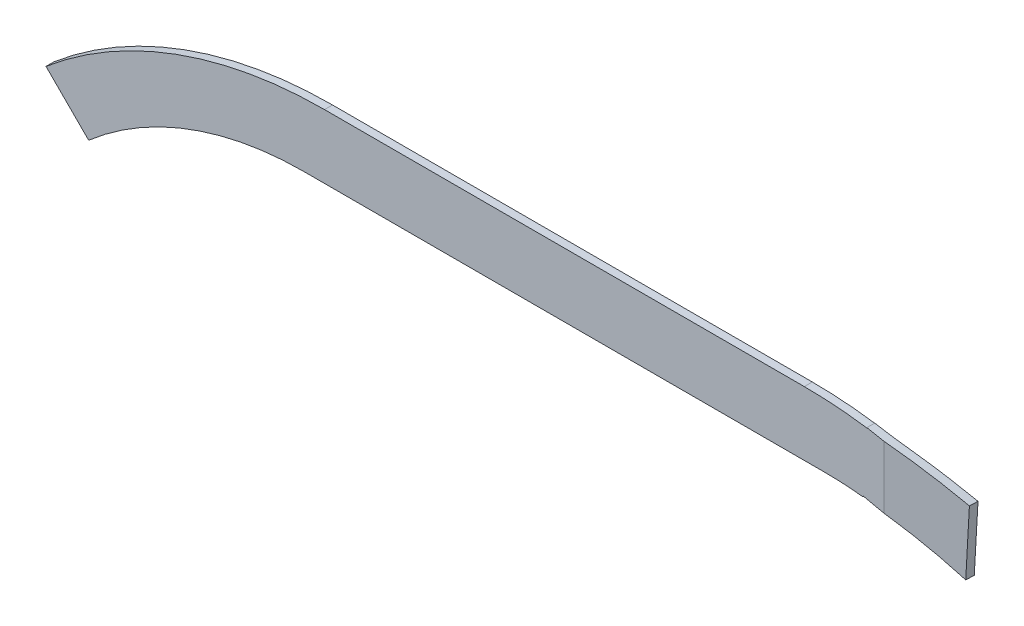
ISO-10303-21;
HEADER;
FILE_DESCRIPTION(('STEP AP214'),'2;1');
FILE_NAME('part.step','',(''),(''),'','','');
FILE_SCHEMA(('AUTOMOTIVE_DESIGN { 1 0 10303 214 1 1 1 1 }'));
ENDSEC;
DATA;
#1=APPLICATION_CONTEXT('core data for automotive mechanical design processes');
#2=APPLICATION_PROTOCOL_DEFINITION('international standard','automotive_design',2000,#1);
#3=PRODUCT_CONTEXT('',#1,'mechanical');
#4=PRODUCT('Part','Part','',(#3));
#5=PRODUCT_RELATED_PRODUCT_CATEGORY('part','',(#4));
#6=PRODUCT_DEFINITION_FORMATION('','',#4);
#7=PRODUCT_DEFINITION_CONTEXT('part definition',#1,'design');
#8=PRODUCT_DEFINITION('design','',#6,#7);
#9=PRODUCT_DEFINITION_SHAPE('','',#8);
#10=(LENGTH_UNIT() NAMED_UNIT(*) SI_UNIT(.MILLI.,.METRE.));
#11=(NAMED_UNIT(*) PLANE_ANGLE_UNIT() SI_UNIT($,.RADIAN.));
#12=(NAMED_UNIT(*) SI_UNIT($,.STERADIAN.) SOLID_ANGLE_UNIT());
#13=UNCERTAINTY_MEASURE_WITH_UNIT(LENGTH_MEASURE(1.E-05),#10,'distance_accuracy_value','');
#14=(GEOMETRIC_REPRESENTATION_CONTEXT(3) GLOBAL_UNCERTAINTY_ASSIGNED_CONTEXT((#13)) GLOBAL_UNIT_ASSIGNED_CONTEXT((#10,
#11,#12)) REPRESENTATION_CONTEXT('',''));
#15=CARTESIAN_POINT('',(0.,0.,0.));
#16=DIRECTION('',(0.,0.,1.));
#17=DIRECTION('',(1.,0.,0.));
#18=AXIS2_PLACEMENT_3D('',#15,#16,#17);
#19=CARTESIAN_POINT('',(-5.,53.,6.00000000000002));
#20=DIRECTION('',(0.,0.,1.));
#21=DIRECTION('',(1.,0.,0.));
#22=AXIS2_PLACEMENT_3D('',#19,#20,#21);
#23=PLANE('',#22);
#24=CARTESIAN_POINT('',(37.4165738677394,-25.,6.00000000000002));
#25=DIRECTION('',(0.,0.,-1.));
#26=DIRECTION('',(-1.,0.,0.));
#27=AXIS2_PLACEMENT_3D('',#24,#25,#26);
#28=CIRCLE('',#27,41.);
#29=CARTESIAN_POINT('',(10.50275297923,5.92969843340272,6.00000000000002));
#30=VERTEX_POINT('',#29);
#31=CARTESIAN_POINT('',(37.4165738677394,16.,6.00000000000002));
#32=VERTEX_POINT('',#31);
#33=EDGE_CURVE('E285',#30,#32,#28,.T.);
#34=ORIENTED_EDGE('',*,*,#33,.F.);
#35=DIRECTION('',(-0.707106781186548,0.707106781186548,0.));
#36=VECTOR('',#35,1.);
#37=CARTESIAN_POINT('',(-20.7837742936837,37.2162257063164,6.00000000000002));
#38=LINE('',#37,#36);
#39=CARTESIAN_POINT('',(5.16815227012212,11.2642991425106,6.00000000000002));
#40=VERTEX_POINT('',#39);
#41=EDGE_CURVE('E391',#30,#40,#38,.T.);
#42=ORIENTED_EDGE('',*,*,#41,.T.);
#43=CARTESIAN_POINT('',(40.,-30.,6.00000000000002));
#44=DIRECTION('',(0.,0.,1.));
#45=DIRECTION('',(-1.,0.,0.));
#46=AXIS2_PLACEMENT_3D('',#43,#44,#45);
#47=CIRCLE('',#46,54.);
#48=CARTESIAN_POINT('',(40.,24.,6.00000000000002));
#49=VERTEX_POINT('',#48);
#50=EDGE_CURVE('E281',#49,#40,#47,.T.);
#51=ORIENTED_EDGE('',*,*,#50,.F.);
#52=DIRECTION('',(-1.,0.,0.));
#53=VECTOR('',#52,1.);
#54=CARTESIAN_POINT('',(40.,24.,6.00000000000002));
#55=LINE('',#54,#53);
#56=CARTESIAN_POINT('',(100.,24.,6.00000000000002));
#57=VERTEX_POINT('',#56);
#58=EDGE_CURVE('E277',#57,#49,#55,.T.);
#59=ORIENTED_EDGE('',*,*,#58,.F.);
#60=CARTESIAN_POINT('',(100.,-30.,6.00000000000002));
#61=DIRECTION('',(0.,0.,1.));
#62=DIRECTION('',(-1.,0.,0.));
#63=AXIS2_PLACEMENT_3D('',#60,#61,#62);
#64=CIRCLE('',#63,54.);
#65=CARTESIAN_POINT('',(107.805696866229,23.4328653211911,6.00000000000002));
#66=VERTEX_POINT('',#65);
#67=EDGE_CURVE('E273',#66,#57,#64,.T.);
#68=ORIENTED_EDGE('',*,*,#67,.F.);
#69=DIRECTION('',(0.,-1.,0.));
#70=VECTOR('',#69,1.);
#71=CARTESIAN_POINT('',(107.805696866229,53.,6.00000000000002));
#72=LINE('',#71,#70);
#73=CARTESIAN_POINT('',(107.805696866229,15.719006077765,6.00000000000002));
#74=VERTEX_POINT('',#73);
#75=EDGE_CURVE('E300',#66,#74,#72,.T.);
#76=ORIENTED_EDGE('',*,*,#75,.T.);
#77=CARTESIAN_POINT('',(107.229892622002,15.8333959558072,6.00000000000002));
#78=CARTESIAN_POINT('',(107.325952526863,15.8147967484685,6.00000000000002));
#79=CARTESIAN_POINT('',(107.421966166312,15.7959646549624,6.00000000000002));
#80=CARTESIAN_POINT('',(107.613900914388,15.757834695615,6.00000000000002));
#81=CARTESIAN_POINT('',(107.709822023014,15.7385368297738,6.00000000000002));
#82=CARTESIAN_POINT('',(107.805696866229,15.719006077765,6.00000000000002));
#83=B_SPLINE_CURVE_WITH_KNOTS('',3,(#77,#78,#79,#80,#81,#82),.UNSPECIFIED.,.F.,.F.,(4,2,4),(0.,
0.293529215505156,0.587058431010277),.UNSPECIFIED.);
#84=CARTESIAN_POINT('',(107.229892622002,15.8333959558072,6.00000000000002));
#85=VERTEX_POINT('',#84);
#86=EDGE_CURVE('E262',#85,#74,#83,.T.);
#87=ORIENTED_EDGE('',*,*,#86,.F.);
#88=DIRECTION('',(0.,1.,0.));
#89=VECTOR('',#88,1.);
#90=CARTESIAN_POINT('',(107.229892622002,53.,6.00000000000002));
#91=LINE('',#90,#89);
#92=CARTESIAN_POINT('',(107.229892622002,15.7358607268793,6.00000000000002));
#93=VERTEX_POINT('',#92);
#94=EDGE_CURVE('E176',#93,#85,#91,.T.);
#95=ORIENTED_EDGE('',*,*,#94,.F.);
#96=CARTESIAN_POINT('',(102.583426132261,-25.,6.00000000000002));
#97=DIRECTION('',(0.,0.,-1.));
#98=DIRECTION('',(-1.,0.,0.));
#99=AXIS2_PLACEMENT_3D('',#96,#97,#98);
#100=CIRCLE('',#99,41.);
#101=CARTESIAN_POINT('',(102.583426132261,16.,6.00000000000002));
#102=VERTEX_POINT('',#101);
#103=EDGE_CURVE('E292',#102,#93,#100,.T.);
#104=ORIENTED_EDGE('',*,*,#103,.F.);
#105=DIRECTION('',(1.,0.,0.));
#106=VECTOR('',#105,1.);
#107=CARTESIAN_POINT('',(102.583426132261,16.,6.00000000000002));
#108=LINE('',#107,#106);
#109=EDGE_CURVE('E288',#32,#102,#108,.T.);
#110=ORIENTED_EDGE('',*,*,#109,.F.);
#111=EDGE_LOOP('',(#34,#42,#51,#59,#68,#76,#87,#95,#104,#110));
#112=FACE_BOUND('',#111,.T.);
#113=ADVANCED_FACE('F41',(#112),#23,.F.);
#114=CARTESIAN_POINT('',(107.805696866229,53.,-34.));
#115=DIRECTION('',(0.,-1.,0.));
#116=DIRECTION('',(0.,0.,-1.));
#117=AXIS2_PLACEMENT_3D('',#114,#115,#116);
#118=CYLINDRICAL_SURFACE('',#117,40.);
#119=CARTESIAN_POINT('',(112.228795048327,22.5311765103987,5.75470038211225));
#120=CARTESIAN_POINT('',(112.046242302623,22.5749255483488,5.7750113125426));
#121=CARTESIAN_POINT('',(111.863397010505,22.6180306834272,5.79408149976551));
#122=CARTESIAN_POINT('',(111.497290726682,22.7029130055846,5.8297116932846));
#123=CARTESIAN_POINT('',(111.314030116131,22.74469110218,5.84627344946776));
#124=CARTESIAN_POINT('',(110.947092914533,22.8269212112088,5.87687940004831));
#125=CARTESIAN_POINT('',(110.763416559715,22.8673738381911,5.89092477504865));
#126=CARTESIAN_POINT('',(110.395647573985,22.9469546884162,5.91648937377092));
#127=CARTESIAN_POINT('',(110.211555052353,22.986083224063,5.92800919693166));
#128=CARTESIAN_POINT('',(109.842951631289,23.0630174659587,5.94851268092072));
#129=CARTESIAN_POINT('',(109.658440729366,23.1008231643087,5.95749632660732));
#130=CARTESIAN_POINT('',(109.289001805074,23.1751122057899,5.9729157728732));
#131=CARTESIAN_POINT('',(109.10407369557,23.2115952389111,5.9793509796049));
#132=CARTESIAN_POINT('',(108.733800031306,23.2832393087292,5.98966043632458));
#133=CARTESIAN_POINT('',(108.54845432124,23.3183997162651,5.99353348168896));
#134=CARTESIAN_POINT('',(108.177345147268,23.3873987615331,5.998704265971));
#135=CARTESIAN_POINT('',(107.991581480299,23.4212364440595,6.00000017630352));
#136=CARTESIAN_POINT('',(107.805696866229,23.4543969740217,6.00000000000008));
#137=B_SPLINE_CURVE_WITH_KNOTS('',3,(#119,#120,#121,#122,#123,#124,#125,#126,#127,#128,#129,
#130,#131,#132,#133,#134,#135,#136),.UNSPECIFIED.,.F.,.F.,(4,2,2,2,2,2,2,2,4),(0.,
0.566447119893804,1.13249724673996,1.69828110211059,2.26393052315543,2.82958332122104,
3.39536785254569,3.96141820394603,4.52787004866042),.UNSPECIFIED.);
#138=CARTESIAN_POINT('',(112.228795048327,22.5311765103987,5.75470038211225));
#139=VERTEX_POINT('',#138);
#140=CARTESIAN_POINT('',(107.819101892787,23.4520044315167,6.00000000000002));
#141=VERTEX_POINT('',#140);
#142=EDGE_CURVE('E237',#139,#141,#137,.T.);
#143=ORIENTED_EDGE('',*,*,#142,.F.);
#144=DIRECTION('',(0.,-1.,0.));
#145=VECTOR('',#144,1.);
#146=CARTESIAN_POINT('',(112.228795048327,53.,5.75470038211225));
#147=LINE('',#146,#145);
#148=CARTESIAN_POINT('',(112.228795048328,14.6373456000813,5.75470038211221));
#149=VERTEX_POINT('',#148);
#150=EDGE_CURVE('E316',#139,#149,#147,.T.);
#151=ORIENTED_EDGE('',*,*,#150,.T.);
#152=CARTESIAN_POINT('',(107.805696866229,15.719006077765,6.00000000000002));
#153=CARTESIAN_POINT('',(107.992188852937,15.6810164636429,6.00000024245419));
#154=CARTESIAN_POINT('',(108.178495760621,15.6421195442395,5.99869578715552));
#155=CARTESIAN_POINT('',(108.550534791599,15.5625549925365,5.99349688170013));
#156=CARTESIAN_POINT('',(108.736267261402,15.5218888415111,5.98960456064643));
#157=CARTESIAN_POINT('',(109.107158743196,15.4387898156848,5.97925207707744));
#158=CARTESIAN_POINT('',(109.292318011765,15.3963579119766,5.97279330972304));
#159=CARTESIAN_POINT('',(109.662064449442,15.3097307593911,5.95732883682511));
#160=CARTESIAN_POINT('',(109.846651758596,15.2655359862197,5.94832381444173));
#161=CARTESIAN_POINT('',(110.215252958032,15.1753860980521,5.92778620588775));
#162=CARTESIAN_POINT('',(110.399266854046,15.1294310007135,5.91625364506509));
#163=CARTESIAN_POINT('',(110.766725606352,15.0357612177415,5.89067859126625));
#164=CARTESIAN_POINT('',(110.950170291478,14.9880460497168,5.87663540607271));
#165=CARTESIAN_POINT('',(111.31649202531,14.8908565010927,5.84605521635442));
#166=CARTESIAN_POINT('',(111.499368710543,14.8413811767322,5.82951685808455));
#167=CARTESIAN_POINT('',(111.864555835117,14.7406709852426,5.79396124994258));
#168=CARTESIAN_POINT('',(112.046865696645,14.6894347269639,5.77494200538327));
#169=CARTESIAN_POINT('',(112.228795048327,14.6373456000814,5.75470038211226));
#170=B_SPLINE_CURVE_WITH_KNOTS('',3,(#152,#153,#154,#155,#156,#157,#158,#159,#160,#161,#162,
#163,#164,#165,#166,#167,#168,#169),.UNSPECIFIED.,.F.,.F.,(4,2,2,2,2,2,2,2,4),(0.,
0.57095897178896,1.14144878141641,1.71162888708951,2.28165615837768,2.8516777132924,
3.4218566748888,3.9923461044523,4.56329708042386),.UNSPECIFIED.);
#171=EDGE_CURVE('E255',#74,#149,#170,.T.);
#172=ORIENTED_EDGE('',*,*,#171,.F.);
#173=ORIENTED_EDGE('',*,*,#75,.F.);
#174=CARTESIAN_POINT('',(107.819101892787,23.430905341293,6.00000000000002));
#175=VERTEX_POINT('',#174);
#176=EDGE_CURVE('E274',#175,#66,#64,.T.);
#177=ORIENTED_EDGE('',*,*,#176,.F.);
#178=DIRECTION('',(0.,-1.,0.));
#179=VECTOR('',#178,1.);
#180=CARTESIAN_POINT('',(107.819101892787,35.1683171981776,6.00000000000002));
#181=LINE('',#180,#179);
#182=EDGE_CURVE('E269',#141,#175,#181,.T.);
#183=ORIENTED_EDGE('',*,*,#182,.F.);
#184=EDGE_LOOP('',(#143,#151,#172,#173,#177,#183));
#185=FACE_BOUND('',#184,.T.);
#186=ADVANCED_FACE('F248',(#185),#118,.F.);
#187=CARTESIAN_POINT('',(112.228795048327,53.,5.75470038211225));
#188=DIRECTION('',(0.110577454552469,0.,0.993867509552806));
#189=DIRECTION('',(0.993867509552806,0.,-0.110577454552469));
#190=AXIS2_PLACEMENT_3D('',#187,#188,#189);
#191=PLANE('',#190);
#192=CARTESIAN_POINT('',(120.437029898498,20.0935263937452,4.84145419247758));
#193=CARTESIAN_POINT('',(116.153638722651,21.6191600717843,5.3180232406909));
#194=CARTESIAN_POINT('',(111.731101248432,22.781977164328,5.81007367182137));
#195=CARTESIAN_POINT('',(107.264057802882,23.5549666442487,6.30707582637061));
#196=B_SPLINE_CURVE_WITH_KNOTS('',3,(#192,#193,#194,#195),.UNSPECIFIED.,.F.,.F.,(4,4),
(-1.32347226164895,-1.15249007673264),.UNSPECIFIED.);
#197=CARTESIAN_POINT('',(119.650012147564,20.3692209879495,4.92901759378555));
#198=VERTEX_POINT('',#197);
#199=EDGE_CURVE('E244',#198,#139,#196,.T.);
#200=ORIENTED_EDGE('',*,*,#199,.F.);
#201=DIRECTION('',(-0.0507700159506557,-0.998694396763309,0.0056486594817229));
#202=VECTOR('',#201,1.);
#203=CARTESIAN_POINT('',(121.285148691154,52.5339086180189,4.74709270430276));
#204=LINE('',#203,#202);
#205=CARTESIAN_POINT('',(119.232725745028,12.1608014266279,4.97544477624989));
#206=VERTEX_POINT('',#205);
#207=EDGE_CURVE('E163',#198,#206,#204,.T.);
#208=ORIENTED_EDGE('',*,*,#207,.T.);
#209=CARTESIAN_POINT('',(107.264057802882,15.8333959558072,6.30707582637061));
#210=CARTESIAN_POINT('',(111.625000367508,14.9785892119174,5.82187842972483));
#211=CARTESIAN_POINT('',(115.926853453421,13.6234503521671,5.34325531394054));
#212=CARTESIAN_POINT('',(120.016541822504,11.8221268769655,4.88823759234345));
#213=B_SPLINE_CURVE_WITH_KNOTS('',3,(#209,#210,#211,#212),.UNSPECIFIED.,.F.,.F.,(4,4),
(-1.21971872537203,-0.997934063477432),.UNSPECIFIED.);
#214=EDGE_CURVE('E161',#149,#206,#213,.T.);
#215=ORIENTED_EDGE('',*,*,#214,.F.);
#216=ORIENTED_EDGE('',*,*,#150,.F.);
#217=EDGE_LOOP('',(#200,#208,#215,#216));
#218=FACE_BOUND('',#217,.T.);
#219=ADVANCED_FACE('F43',(#218),#191,.F.);
#220=CARTESIAN_POINT('',(107.819101892787,35.1683171981776,10.));
#221=DIRECTION('',(1.,0.,0.));
#222=DIRECTION('',(0.,0.,-1.));
#223=AXIS2_PLACEMENT_3D('',#220,#221,#222);
#224=PLANE('',#223);
#225=DIRECTION('',(0.,0.,-1.));
#226=VECTOR('',#225,1.);
#227=CARTESIAN_POINT('',(107.819101892787,23.430905341293,10.));
#228=LINE('',#227,#226);
#229=CARTESIAN_POINT('',(107.819101892787,23.430905341293,7.00000000000002));
#230=VERTEX_POINT('',#229);
#231=EDGE_CURVE('E296',#230,#175,#228,.T.);
#232=ORIENTED_EDGE('',*,*,#231,.F.);
#233=DIRECTION('',(0.,1.,0.));
#234=VECTOR('',#233,1.);
#235=CARTESIAN_POINT('',(107.819101892787,35.1683171981776,7.00000000000002));
#236=LINE('',#235,#234);
#237=CARTESIAN_POINT('',(107.819101892787,23.4717915384023,7.00000000000002));
#238=VERTEX_POINT('',#237);
#239=EDGE_CURVE('E178',#230,#238,#236,.T.);
#240=ORIENTED_EDGE('',*,*,#239,.T.);
#241=CARTESIAN_POINT('',(107.819101892787,23.4520044315167,6.00000000000002));
#242=CARTESIAN_POINT('',(107.819101892787,23.4652492584886,6.66666248374207));
#243=CARTESIAN_POINT('',(107.819101892787,23.4783870847022,7.33332705894643));
#244=CARTESIAN_POINT('',(107.819101892787,23.5044487356127,8.66666039227976));
#245=CARTESIAN_POINT('',(107.819101892787,23.5173725603096,9.33332915040874));
#246=CARTESIAN_POINT('',(107.819101892787,23.5301893842481,10.));
#247=B_SPLINE_CURVE_WITH_KNOTS('',3,(#241,#242,#243,#244,#245,#246),.UNSPECIFIED.,.F.,.F.,(4,2,
4),(0.,2.00038204470802,4.00076408941604),.UNSPECIFIED.);
#248=EDGE_CURVE('E229',#141,#238,#247,.T.);
#249=ORIENTED_EDGE('',*,*,#248,.F.);
#250=ORIENTED_EDGE('',*,*,#182,.T.);
#251=EDGE_LOOP('',(#232,#240,#249,#250));
#252=FACE_BOUND('',#251,.T.);
#253=ADVANCED_FACE('F360',(#252),#224,.F.);
#254=CARTESIAN_POINT('',(102.583426132261,-25.,10.));
#255=DIRECTION('',(0.,0.,-1.));
#256=DIRECTION('',(-1.,0.,0.));
#257=AXIS2_PLACEMENT_3D('',#254,#255,#256);
#258=CYLINDRICAL_SURFACE('',#257,41.);
#259=CARTESIAN_POINT('',(102.583426132261,-25.,-35.7623293741911));
#260=DIRECTION('',(0.993867509552806,0.,-0.110577454552469));
#261=DIRECTION('',(-0.110577454552469,0.,-0.993867509552806));
#262=AXIS2_PLACEMENT_3D('',#259,#260,#261);
#263=ELLIPSE('',#262,370.780826579304,41.);
#264=CARTESIAN_POINT('',(107.341152375933,15.7230161087103,7.00000000000002));
#265=VERTEX_POINT('',#264);
#266=EDGE_CURVE('E320',#265,#93,#263,.F.);
#267=ORIENTED_EDGE('',*,*,#266,.F.);
#268=CARTESIAN_POINT('',(102.583426132261,-25.,7.00000000000002));
#269=DIRECTION('',(0.,0.,-1.));
#270=DIRECTION('',(-1.,0.,0.));
#271=AXIS2_PLACEMENT_3D('',#268,#269,#270);
#272=CIRCLE('',#271,41.);
#273=CARTESIAN_POINT('',(102.583426132261,16.,7.00000000000002));
#274=VERTEX_POINT('',#273);
#275=EDGE_CURVE('E334',#265,#274,#272,.F.);
#276=ORIENTED_EDGE('',*,*,#275,.T.);
#277=DIRECTION('',(0.,0.,-1.));
#278=VECTOR('',#277,1.);
#279=CARTESIAN_POINT('',(102.583426132261,16.,10.));
#280=LINE('',#279,#278);
#281=EDGE_CURVE('E297',#274,#102,#280,.T.);
#282=ORIENTED_EDGE('',*,*,#281,.T.);
#283=ORIENTED_EDGE('',*,*,#103,.T.);
#284=EDGE_LOOP('',(#267,#276,#282,#283));
#285=FACE_BOUND('',#284,.T.);
#286=ADVANCED_FACE('F221',(#285),#258,.F.);
#287=CARTESIAN_POINT('',(102.583426132261,16.,10.));
#288=DIRECTION('',(0.,1.,0.));
#289=DIRECTION('',(0.,0.,1.));
#290=AXIS2_PLACEMENT_3D('',#287,#288,#289);
#291=PLANE('',#290);
#292=ORIENTED_EDGE('',*,*,#281,.F.);
#293=DIRECTION('',(-1.,0.,0.));
#294=VECTOR('',#293,1.);
#295=CARTESIAN_POINT('',(102.583426132261,16.,7.00000000000002));
#296=LINE('',#295,#294);
#297=CARTESIAN_POINT('',(37.4165738677394,16.,7.00000000000002));
#298=VERTEX_POINT('',#297);
#299=EDGE_CURVE('E403',#274,#298,#296,.T.);
#300=ORIENTED_EDGE('',*,*,#299,.T.);
#301=DIRECTION('',(0.,0.,-1.));
#302=VECTOR('',#301,1.);
#303=CARTESIAN_POINT('',(37.4165738677394,16.,10.));
#304=LINE('',#303,#302);
#305=EDGE_CURVE('E301',#298,#32,#304,.T.);
#306=ORIENTED_EDGE('',*,*,#305,.T.);
#307=ORIENTED_EDGE('',*,*,#109,.T.);
#308=EDGE_LOOP('',(#292,#300,#306,#307));
#309=FACE_BOUND('',#308,.T.);
#310=ADVANCED_FACE('F433',(#309),#291,.F.);
#311=CARTESIAN_POINT('',(37.4165738677394,-25.,10.));
#312=DIRECTION('',(0.,0.,-1.));
#313=DIRECTION('',(-1.,0.,0.));
#314=AXIS2_PLACEMENT_3D('',#311,#312,#313);
#315=CYLINDRICAL_SURFACE('',#314,41.);
#316=CARTESIAN_POINT('',(37.4165738677394,-25.,7.00000000000002));
#317=DIRECTION('',(0.,0.,-1.));
#318=DIRECTION('',(-1.,0.,0.));
#319=AXIS2_PLACEMENT_3D('',#316,#317,#318);
#320=CIRCLE('',#319,41.);
#321=CARTESIAN_POINT('',(10.50275297923,5.92969843340272,7.00000000000002));
#322=VERTEX_POINT('',#321);
#323=EDGE_CURVE('E407',#298,#322,#320,.F.);
#324=ORIENTED_EDGE('',*,*,#323,.T.);
#325=DIRECTION('',(0.,0.,-1.));
#326=VECTOR('',#325,1.);
#327=CARTESIAN_POINT('',(10.50275297923,5.92969843340272,10.));
#328=LINE('',#327,#326);
#329=EDGE_CURVE('E57',#322,#30,#328,.T.);
#330=ORIENTED_EDGE('',*,*,#329,.T.);
#331=ORIENTED_EDGE('',*,*,#33,.T.);
#332=ORIENTED_EDGE('',*,*,#305,.F.);
#333=EDGE_LOOP('',(#324,#330,#331,#332));
#334=FACE_BOUND('',#333,.T.);
#335=ADVANCED_FACE('F429',(#334),#315,.F.);
#336=CARTESIAN_POINT('',(40.,-30.,10.));
#337=DIRECTION('',(0.,0.,-1.));
#338=DIRECTION('',(-1.,0.,0.));
#339=AXIS2_PLACEMENT_3D('',#336,#337,#338);
#340=CYLINDRICAL_SURFACE('',#339,54.);
#341=ORIENTED_EDGE('',*,*,#50,.T.);
#342=DIRECTION('',(0.,0.,-1.));
#343=VECTOR('',#342,1.);
#344=CARTESIAN_POINT('',(5.16815227012212,11.2642991425106,10.));
#345=LINE('',#344,#343);
#346=CARTESIAN_POINT('',(5.16815227012213,11.2642991425106,7.00000000000002));
#347=VERTEX_POINT('',#346);
#348=EDGE_CURVE('E379',#40,#347,#345,.F.);
#349=ORIENTED_EDGE('',*,*,#348,.T.);
#350=CARTESIAN_POINT('',(40.,-30.,7.00000000000002));
#351=DIRECTION('',(0.,0.,-1.));
#352=DIRECTION('',(-1.,0.,0.));
#353=AXIS2_PLACEMENT_3D('',#350,#351,#352);
#354=CIRCLE('',#353,54.);
#355=CARTESIAN_POINT('',(40.,24.,7.00000000000002));
#356=VERTEX_POINT('',#355);
#357=EDGE_CURVE('E411',#347,#356,#354,.T.);
#358=ORIENTED_EDGE('',*,*,#357,.T.);
#359=DIRECTION('',(0.,0.,-1.));
#360=VECTOR('',#359,1.);
#361=CARTESIAN_POINT('',(40.,24.,10.));
#362=LINE('',#361,#360);
#363=EDGE_CURVE('E305',#356,#49,#362,.T.);
#364=ORIENTED_EDGE('',*,*,#363,.T.);
#365=EDGE_LOOP('',(#341,#349,#358,#364));
#366=FACE_BOUND('',#365,.T.);
#367=ADVANCED_FACE('F426',(#366),#340,.T.);
#368=CARTESIAN_POINT('',(40.,24.,10.));
#369=DIRECTION('',(0.,-1.,0.));
#370=DIRECTION('',(0.,0.,-1.));
#371=AXIS2_PLACEMENT_3D('',#368,#369,#370);
#372=PLANE('',#371);
#373=ORIENTED_EDGE('',*,*,#363,.F.);
#374=DIRECTION('',(1.,0.,0.));
#375=VECTOR('',#374,1.);
#376=CARTESIAN_POINT('',(40.,24.,7.00000000000002));
#377=LINE('',#376,#375);
#378=CARTESIAN_POINT('',(100.,24.,7.00000000000002));
#379=VERTEX_POINT('',#378);
#380=EDGE_CURVE('E414',#356,#379,#377,.T.);
#381=ORIENTED_EDGE('',*,*,#380,.T.);
#382=DIRECTION('',(0.,0.,-1.));
#383=VECTOR('',#382,1.);
#384=CARTESIAN_POINT('',(100.,24.,10.));
#385=LINE('',#384,#383);
#386=EDGE_CURVE('E308',#379,#57,#385,.T.);
#387=ORIENTED_EDGE('',*,*,#386,.T.);
#388=ORIENTED_EDGE('',*,*,#58,.T.);
#389=EDGE_LOOP('',(#373,#381,#387,#388));
#390=FACE_BOUND('',#389,.T.);
#391=ADVANCED_FACE('F424',(#390),#372,.F.);
#392=CARTESIAN_POINT('',(100.,-30.,10.));
#393=DIRECTION('',(0.,0.,-1.));
#394=DIRECTION('',(-1.,0.,0.));
#395=AXIS2_PLACEMENT_3D('',#392,#393,#394);
#396=CYLINDRICAL_SURFACE('',#395,54.);
#397=ORIENTED_EDGE('',*,*,#386,.F.);
#398=CARTESIAN_POINT('',(100.,-30.,7.00000000000002));
#399=DIRECTION('',(0.,0.,-1.));
#400=DIRECTION('',(-1.,0.,0.));
#401=AXIS2_PLACEMENT_3D('',#398,#399,#400);
#402=CIRCLE('',#401,54.);
#403=EDGE_CURVE('E418',#379,#230,#402,.T.);
#404=ORIENTED_EDGE('',*,*,#403,.T.);
#405=ORIENTED_EDGE('',*,*,#231,.T.);
#406=ORIENTED_EDGE('',*,*,#176,.T.);
#407=ORIENTED_EDGE('',*,*,#67,.T.);
#408=EDGE_LOOP('',(#397,#404,#405,#406,#407));
#409=FACE_BOUND('',#408,.T.);
#410=ADVANCED_FACE('F369',(#409),#396,.T.);
#411=CARTESIAN_POINT('',(106.821747984672,15.8333959558072,2.33160578815939));
#412=CARTESIAN_POINT('',(111.182690549298,14.9785892119174,1.84640839151361));
#413=CARTESIAN_POINT('',(115.484543635211,13.6234503521671,1.36778527572932));
#414=CARTESIAN_POINT('',(119.574232004294,11.8221268769655,0.912767554132233));
#415=B_SPLINE_CURVE_WITH_KNOTS('',3,(#411,#412,#413,#414),.UNSPECIFIED.,.F.,.F.,(4,4),
(-1.21971872537203,-0.997934063477432),.UNSPECIFIED.);
#416=DIRECTION('',(0.110577454552469,0.,0.993867509552806));
#417=VECTOR('',#416,1.);
#418=SURFACE_OF_LINEAR_EXTRUSION('',#415,#417);
#419=CARTESIAN_POINT('',(119.235245458769,12.2103665430976,6.06546605906822));
#420=CARTESIAN_POINT('',(119.234775228726,12.2011166939452,5.86146272549974));
#421=CARTESIAN_POINT('',(119.234304243395,12.191851980218,5.65746006983294));
#422=CARTESIAN_POINT('',(119.23336076216,12.173292823614,5.24945611430273));
#423=CARTESIAN_POINT('',(119.232888266254,12.1639983807372,5.04545481443931));
#424=CARTESIAN_POINT('',(119.232415015062,12.1546890732857,4.84145419247759));
#425=B_SPLINE_CURVE_WITH_KNOTS('',3,(#419,#420,#421,#422,#423,#424),.UNSPECIFIED.,.F.,.F.,(4,2,
4),(0.,0.612640402194144,1.22528080438829),.UNSPECIFIED.);
#426=CARTESIAN_POINT('',(119.235207681255,12.2096234676756,6.04907839310125));
#427=VERTEX_POINT('',#426);
#428=EDGE_CURVE('E147',#427,#206,#425,.T.);
#429=ORIENTED_EDGE('',*,*,#428,.F.);
#430=CARTESIAN_POINT('',(109.942912406332,15.2702021205033,7.00000000000002));
#431=CARTESIAN_POINT('',(110.491514805247,15.1373617581184,6.94385909408924));
#432=CARTESIAN_POINT('',(111.03826000724,14.9967953812757,6.88790824334014));
#433=CARTESIAN_POINT('',(112.127651326727,14.7004151487921,6.77642601925892));
#434=CARTESIAN_POINT('',(112.670297404218,14.5446011445593,6.72089465002044));
#435=CARTESIAN_POINT('',(113.798764859863,14.2035247339933,6.60541359238006));
#436=CARTESIAN_POINT('',(114.384172282897,14.0168770691534,6.54550626583349));
#437=CARTESIAN_POINT('',(115.549151630822,13.6259953099713,6.42628878503276));
#438=CARTESIAN_POINT('',(116.128723499831,13.4217610473958,6.36697863649726));
#439=CARTESIAN_POINT('',(117.283606476356,12.99512681968,6.24879436196384));
#440=CARTESIAN_POINT('',(117.858894424143,12.7726634935503,6.18992260600325));
#441=CARTESIAN_POINT('',(119.002518584017,12.3103767031861,6.07289049589251));
#442=CARTESIAN_POINT('',(119.570854865754,12.0705534130494,6.01473013461484));
#443=CARTESIAN_POINT('',(120.135446829763,11.8221268769655,5.95695294590385));
#444=B_SPLINE_CURVE_WITH_KNOTS('',3,(#430,#431,#432,#433,#434,#435,#436,#437,#438,#439,#440,
#441,#442,#443),.UNSPECIFIED.,.F.,.F.,(4,2,2,2,2,2,4),(0.,1.70165926982971,3.40333512440306,
5.25511959534632,7.10692178240793,8.96545829602296,10.8239761735316),.UNSPECIFIED.);
#445=CARTESIAN_POINT('',(109.942912406332,15.2702021205033,7.00000000000002));
#446=VERTEX_POINT('',#445);
#447=EDGE_CURVE('E159',#446,#427,#444,.T.);
#448=ORIENTED_EDGE('',*,*,#447,.F.);
#449=CARTESIAN_POINT('',(107.341152375933,15.8333959558072,7.00000000000002));
#450=CARTESIAN_POINT('',(107.776831486537,15.749011871757,7.00000000000002));
#451=CARTESIAN_POINT('',(108.211484377705,15.6598870101233,7.00000000000002));
#452=CARTESIAN_POINT('',(109.078737721172,15.4721557316887,7.00000000000002));
#453=CARTESIAN_POINT('',(109.51133817347,15.3735493148878,7.00000000000002));
#454=CARTESIAN_POINT('',(109.942912406332,15.2702021205033,7.00000000000002));
#455=B_SPLINE_CURVE_WITH_KNOTS('',3,(#449,#450,#451,#452,#453,#454),.UNSPECIFIED.,.F.,.F.,(4,2,
4),(0.,1.33108879901487,2.66217759802974),.UNSPECIFIED.);
#456=CARTESIAN_POINT('',(107.341152375933,15.8333959558072,7.00000000000002));
#457=VERTEX_POINT('',#456);
#458=EDGE_CURVE('E332',#457,#446,#455,.T.);
#459=ORIENTED_EDGE('',*,*,#458,.F.);
#460=DIRECTION('',(0.110577454552469,0.,0.993867509552806));
#461=VECTOR('',#460,1.);
#462=CARTESIAN_POINT('',(106.821747984672,15.8333959558072,2.33160578815939));
#463=LINE('',#462,#461);
#464=EDGE_CURVE('E170',#85,#457,#463,.T.);
#465=ORIENTED_EDGE('',*,*,#464,.F.);
#466=ORIENTED_EDGE('',*,*,#86,.T.);
#467=ORIENTED_EDGE('',*,*,#171,.T.);
#468=ORIENTED_EDGE('',*,*,#214,.T.);
#469=EDGE_LOOP('',(#429,#448,#459,#465,#466,#467,#468));
#470=FACE_BOUND('',#469,.T.);
#471=ADVANCED_FACE('F157',(#470),#418,.T.);
#472=CARTESIAN_POINT('',(119.994720080289,20.0935263937452,0.865984154266371));
#473=CARTESIAN_POINT('',(115.711328904441,21.6191600717843,1.34255320247969));
#474=CARTESIAN_POINT('',(111.288791430222,22.781977164328,1.83460363361016));
#475=CARTESIAN_POINT('',(106.821747984672,23.5549666442487,2.33160578815939));
#476=B_SPLINE_CURVE_WITH_KNOTS('',3,(#472,#473,#474,#475),.UNSPECIFIED.,.F.,.F.,(4,4),
(-1.32347226164895,-1.15249007673264),.UNSPECIFIED.);
#477=DIRECTION('',(0.110577454552469,0.,0.993867509552806));
#478=VECTOR('',#477,1.);
#479=SURFACE_OF_LINEAR_EXTRUSION('',#476,#478);
#480=CARTESIAN_POINT('',(119.649846469403,20.3659619412753,4.84145419247758));
#481=CARTESIAN_POINT('',(119.650218975959,20.3732894987639,5.03829035117077));
#482=CARTESIAN_POINT('',(119.650590982034,20.3806072113042,5.23512687631717));
#483=CARTESIAN_POINT('',(119.65133399322,20.3952229464883,5.62880065951639));
#484=CARTESIAN_POINT('',(119.651704998331,20.402520969132,5.8256379175692));
#485=CARTESIAN_POINT('',(119.652075502961,20.4098091468274,6.02247554207522));
#486=B_SPLINE_CURVE_WITH_KNOTS('',3,(#480,#481,#482,#483,#484,#485),.UNSPECIFIED.,.F.,.F.,(4,2,
4),(0.,0.590918559899298,1.1818371197986),.UNSPECIFIED.);
#487=CARTESIAN_POINT('',(119.65204528365,20.4092147042932,6.00642156064405));
#488=VERTEX_POINT('',#487);
#489=EDGE_CURVE('E64',#198,#488,#486,.T.);
#490=ORIENTED_EDGE('',*,*,#489,.F.);
#491=ORIENTED_EDGE('',*,*,#199,.T.);
#492=ORIENTED_EDGE('',*,*,#142,.T.);
#493=ORIENTED_EDGE('',*,*,#248,.T.);
#494=CARTESIAN_POINT('',(109.942912406332,23.0662812171413,7.00000000000002));
#495=CARTESIAN_POINT('',(109.510617372478,23.1548184251696,7.00000000000002));
#496=CARTESIAN_POINT('',(109.077656519684,23.2398108147761,7.00000000000002));
#497=CARTESIAN_POINT('',(108.210403176218,23.4027059571452,7.00000000000002));
#498=CARTESIAN_POINT('',(107.776110685545,23.4806087099079,7.00000000000002));
#499=CARTESIAN_POINT('',(107.341152375933,23.5549666442487,7.00000000000002));
#500=B_SPLINE_CURVE_WITH_KNOTS('',3,(#494,#495,#496,#497,#498,#499),.UNSPECIFIED.,.F.,.F.,(4,2,
4),(0.,1.32367263969811,2.64734527939618),.UNSPECIFIED.);
#501=CARTESIAN_POINT('',(109.942912406332,23.0662812171413,7.00000000000002));
#502=VERTEX_POINT('',#501);
#503=EDGE_CURVE('E171',#502,#238,#500,.T.);
#504=ORIENTED_EDGE('',*,*,#503,.F.);
#505=CARTESIAN_POINT('',(120.556347762761,20.0935263937452,5.91388029488388));
#506=CARTESIAN_POINT('',(120.017028823384,20.2854266193125,5.96907118338774));
#507=CARTESIAN_POINT('',(119.475698029311,20.4715238419074,6.02446795386629));
#508=CARTESIAN_POINT('',(118.38920550616,20.8320760737259,6.13565353131842));
#509=CARTESIAN_POINT('',(117.844043730033,21.0065309396889,6.19144234310679));
#510=CARTESIAN_POINT('',(116.088448376581,21.5477204621341,6.37110016769981));
#511=CARTESIAN_POINT('',(114.870977910205,21.8917749247426,6.49568929643335));
#512=CARTESIAN_POINT('',(113.032497390381,22.3647137044917,6.68382912609218));
#513=CARTESIAN_POINT('',(112.416913326445,22.5153170063568,6.7468245615514));
#514=CARTESIAN_POINT('',(111.182374463505,22.8018402174685,6.87316037467327));
#515=CARTESIAN_POINT('',(110.563419672785,22.9377601627849,6.93650075148817));
#516=CARTESIAN_POINT('',(109.942912406332,23.0662812171413,7.00000000000002));
#517=B_SPLINE_CURVE_WITH_KNOTS('',3,(#505,#506,#507,#508,#509,#510,#511,#512,#513,#514,#515,
#516),.UNSPECIFIED.,.F.,.F.,(4,2,2,2,2,4),(0.,1.72519891929807,3.45041906347727,
7.26255036694895,9.17299299649926,11.0834309329311),.UNSPECIFIED.);
#518=EDGE_CURVE('E153',#488,#502,#517,.T.);
#519=ORIENTED_EDGE('',*,*,#518,.F.);
#520=EDGE_LOOP('',(#490,#491,#492,#493,#504,#519));
#521=FACE_BOUND('',#520,.T.);
#522=ADVANCED_FACE('F215',(#521),#479,.T.);
#523=CARTESIAN_POINT('',(106.821747984672,7.41419077857919,2.33160578815939));
#524=DIRECTION('',(0.993867509552806,0.,-0.110577454552469));
#525=DIRECTION('',(-0.110577454552469,0.,-0.993867509552806));
#526=AXIS2_PLACEMENT_3D('',#523,#524,#525);
#527=PLANE('',#526);
#528=DIRECTION('',(0.,1.,0.));
#529=VECTOR('',#528,1.);
#530=CARTESIAN_POINT('',(107.341152375933,7.41419077857919,7.00000000000002));
#531=LINE('',#530,#529);
#532=EDGE_CURVE('E213',#265,#457,#531,.T.);
#533=ORIENTED_EDGE('',*,*,#532,.F.);
#534=ORIENTED_EDGE('',*,*,#266,.T.);
#535=ORIENTED_EDGE('',*,*,#94,.T.);
#536=ORIENTED_EDGE('',*,*,#464,.T.);
#537=EDGE_LOOP('',(#533,#534,#535,#536));
#538=FACE_BOUND('',#537,.T.);
#539=ADVANCED_FACE('F219',(#538),#527,.T.);
#540=CARTESIAN_POINT('',(3.40788112083328,-5.,7.00000000000002));
#541=DIRECTION('',(0.,0.,-1.));
#542=DIRECTION('',(-1.,0.,0.));
#543=AXIS2_PLACEMENT_3D('',#540,#541,#542);
#544=PLANE('',#543);
#545=ORIENTED_EDGE('',*,*,#357,.F.);
#546=DIRECTION('',(0.707106781186548,-0.707106781186548,0.));
#547=VECTOR('',#546,1.);
#548=CARTESIAN_POINT('',(12.420166266733,4.01228514589971,7.00000000000002));
#549=LINE('',#548,#547);
#550=EDGE_CURVE('E11',#347,#322,#549,.T.);
#551=ORIENTED_EDGE('',*,*,#550,.T.);
#552=ORIENTED_EDGE('',*,*,#323,.F.);
#553=ORIENTED_EDGE('',*,*,#299,.F.);
#554=ORIENTED_EDGE('',*,*,#275,.F.);
#555=ORIENTED_EDGE('',*,*,#532,.T.);
#556=ORIENTED_EDGE('',*,*,#458,.T.);
#557=DIRECTION('',(0.,1.,0.));
#558=VECTOR('',#557,1.);
#559=CARTESIAN_POINT('',(109.942912406332,-5.,7.00000000000002));
#560=LINE('',#559,#558);
#561=EDGE_CURVE('E168',#446,#502,#560,.T.);
#562=ORIENTED_EDGE('',*,*,#561,.T.);
#563=ORIENTED_EDGE('',*,*,#503,.T.);
#564=ORIENTED_EDGE('',*,*,#239,.F.);
#565=ORIENTED_EDGE('',*,*,#403,.F.);
#566=ORIENTED_EDGE('',*,*,#380,.F.);
#567=EDGE_LOOP('',(#545,#551,#552,#553,#554,#555,#556,#562,#563,#564,#565,#566));
#568=FACE_BOUND('',#567,.T.);
#569=ADVANCED_FACE('F202',(#568),#544,.F.);
#570=CARTESIAN_POINT('',(109.942912406332,-5.,7.00000000000002));
#571=DIRECTION('',(-0.101802747844878,0.,-0.99480460419684));
#572=DIRECTION('',(-0.99480460419684,0.,0.101802747844879));
#573=AXIS2_PLACEMENT_3D('',#570,#571,#572);
#574=PLANE('',#573);
#575=ORIENTED_EDGE('',*,*,#447,.T.);
#576=DIRECTION('',(0.0507701406911855,0.998696850527913,-0.00519553267951207));
#577=VECTOR('',#576,1.);
#578=CARTESIAN_POINT('',(118.338408564667,-5.43126625804263,6.1408518066423));
#579=LINE('',#578,#577);
#580=EDGE_CURVE('E50',#427,#488,#579,.T.);
#581=ORIENTED_EDGE('',*,*,#580,.T.);
#582=ORIENTED_EDGE('',*,*,#518,.T.);
#583=ORIENTED_EDGE('',*,*,#561,.F.);
#584=EDGE_LOOP('',(#575,#581,#582,#583));
#585=FACE_BOUND('',#584,.T.);
#586=ADVANCED_FACE('F166',(#585),#574,.F.);
#587=CARTESIAN_POINT('',(119.713110978755,21.6104348810913,7.11242060757567));
#588=DIRECTION('',(-0.998710329992398,0.0507708259384734,0.));
#589=DIRECTION('',(-0.0507708259384734,-0.998710329992398,0.));
#590=AXIS2_PLACEMENT_3D('',#587,#588,#589);
#591=PLANE('',#590);
#592=ORIENTED_EDGE('',*,*,#489,.T.);
#593=ORIENTED_EDGE('',*,*,#580,.F.);
#594=ORIENTED_EDGE('',*,*,#428,.T.);
#595=ORIENTED_EDGE('',*,*,#207,.F.);
#596=EDGE_LOOP('',(#592,#593,#594,#595));
#597=FACE_BOUND('',#596,.T.);
#598=ADVANCED_FACE('F146',(#597),#591,.F.);
#599=CARTESIAN_POINT('',(4.33267462000874,12.099776792624,7.11242060757567));
#600=DIRECTION('',(0.707106781186548,0.707106781186548,0.));
#601=DIRECTION('',(-0.707106781186548,0.707106781186548,0.));
#602=AXIS2_PLACEMENT_3D('',#599,#600,#601);
#603=PLANE('',#602);
#604=ORIENTED_EDGE('',*,*,#329,.F.);
#605=ORIENTED_EDGE('',*,*,#550,.F.);
#606=ORIENTED_EDGE('',*,*,#348,.F.);
#607=ORIENTED_EDGE('',*,*,#41,.F.);
#608=EDGE_LOOP('',(#604,#605,#606,#607));
#609=FACE_BOUND('',#608,.T.);
#610=ADVANCED_FACE('F551',(#609),#603,.F.);
#611=CLOSED_SHELL('',(#113,#186,#219,#253,#286,#310,#335,#367,#391,#410,#471,#522,#539,#569,
#586,#598,#610));
#612=MANIFOLD_SOLID_BREP('B2',#611);
#613=ADVANCED_BREP_SHAPE_REPRESENTATION('',(#18,#612),#14);
#614=SHAPE_DEFINITION_REPRESENTATION(#9,#613);
ENDSEC;
END-ISO-10303-21;
